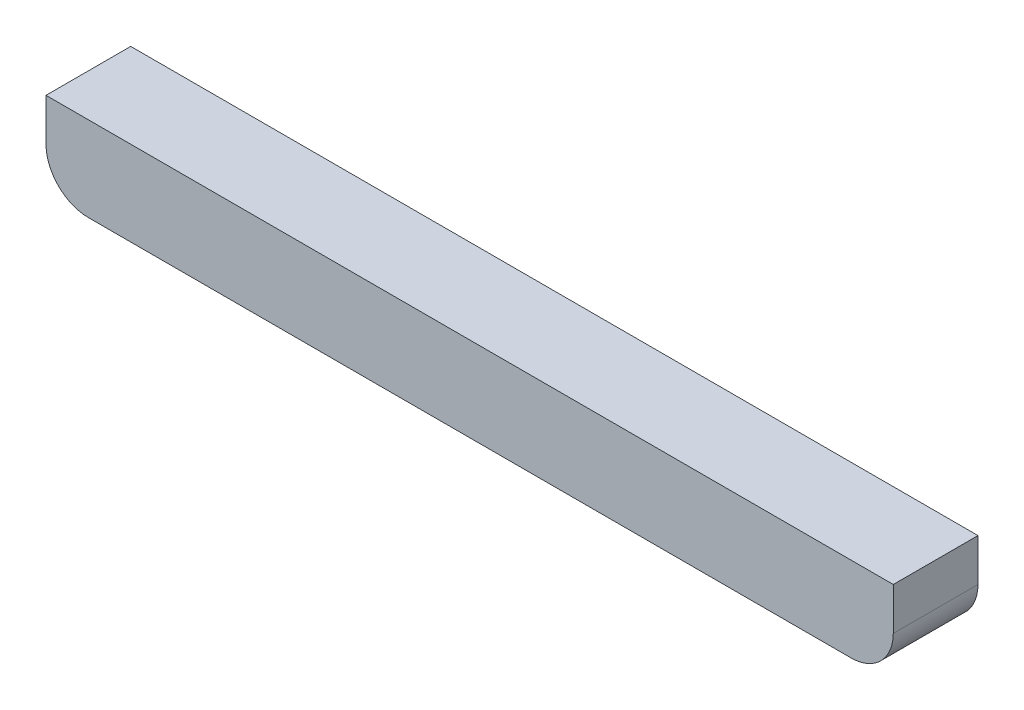
ISO-10303-21;
HEADER;
FILE_DESCRIPTION(('STEP AP214'),'2;1');
FILE_NAME('part.step','',(''),(''),'','','');
FILE_SCHEMA(('AUTOMOTIVE_DESIGN { 1 0 10303 214 1 1 1 1 }'));
ENDSEC;
DATA;
#1=APPLICATION_CONTEXT('core data for automotive mechanical design processes');
#2=APPLICATION_PROTOCOL_DEFINITION('international standard','automotive_design',2000,#1);
#3=PRODUCT_CONTEXT('',#1,'mechanical');
#4=PRODUCT('Part','Part','',(#3));
#5=PRODUCT_RELATED_PRODUCT_CATEGORY('part','',(#4));
#6=PRODUCT_DEFINITION_FORMATION('','',#4);
#7=PRODUCT_DEFINITION_CONTEXT('part definition',#1,'design');
#8=PRODUCT_DEFINITION('design','',#6,#7);
#9=PRODUCT_DEFINITION_SHAPE('','',#8);
#10=(LENGTH_UNIT() NAMED_UNIT(*) SI_UNIT(.MILLI.,.METRE.));
#11=(NAMED_UNIT(*) PLANE_ANGLE_UNIT() SI_UNIT($,.RADIAN.));
#12=(NAMED_UNIT(*) SI_UNIT($,.STERADIAN.) SOLID_ANGLE_UNIT());
#13=UNCERTAINTY_MEASURE_WITH_UNIT(LENGTH_MEASURE(1.E-05),#10,'distance_accuracy_value','');
#14=(GEOMETRIC_REPRESENTATION_CONTEXT(3) GLOBAL_UNCERTAINTY_ASSIGNED_CONTEXT((#13)) GLOBAL_UNIT_ASSIGNED_CONTEXT((#10,
#11,#12)) REPRESENTATION_CONTEXT('',''));
#15=CARTESIAN_POINT('',(0.,0.,0.));
#16=DIRECTION('',(0.,0.,1.));
#17=DIRECTION('',(1.,0.,0.));
#18=AXIS2_PLACEMENT_3D('',#15,#16,#17);
#19=CARTESIAN_POINT('',(0.,0.,5.08));
#20=DIRECTION('',(1.,0.,0.));
#21=DIRECTION('',(0.,0.,-1.));
#22=AXIS2_PLACEMENT_3D('',#19,#20,#21);
#23=PLANE('',#22);
#24=DIRECTION('',(0.,-1.,0.));
#25=VECTOR('',#24,1.);
#26=CARTESIAN_POINT('',(0.,0.,0.));
#27=LINE('',#26,#25);
#28=CARTESIAN_POINT('',(0.,5.08,0.));
#29=VERTEX_POINT('',#28);
#30=CARTESIAN_POINT('',(0.,2.54,0.));
#31=VERTEX_POINT('',#30);
#32=EDGE_CURVE('E112',#29,#31,#27,.T.);
#33=ORIENTED_EDGE('',*,*,#32,.T.);
#34=DIRECTION('',(0.,0.,-1.));
#35=VECTOR('',#34,1.);
#36=CARTESIAN_POINT('',(0.,2.54,5.08));
#37=LINE('',#36,#35);
#38=CARTESIAN_POINT('',(0.,2.54,5.08));
#39=VERTEX_POINT('',#38);
#40=EDGE_CURVE('E56',#31,#39,#37,.F.);
#41=ORIENTED_EDGE('',*,*,#40,.T.);
#42=DIRECTION('',(0.,-1.,0.));
#43=VECTOR('',#42,1.);
#44=CARTESIAN_POINT('',(0.,0.,5.08));
#45=LINE('',#44,#43);
#46=CARTESIAN_POINT('',(0.,5.08,5.08));
#47=VERTEX_POINT('',#46);
#48=EDGE_CURVE('E119',#47,#39,#45,.T.);
#49=ORIENTED_EDGE('',*,*,#48,.F.);
#50=DIRECTION('',(0.,0.,-1.));
#51=VECTOR('',#50,1.);
#52=CARTESIAN_POINT('',(0.,5.08,5.08));
#53=LINE('',#52,#51);
#54=EDGE_CURVE('E104',#47,#29,#53,.T.);
#55=ORIENTED_EDGE('',*,*,#54,.T.);
#56=EDGE_LOOP('',(#33,#41,#49,#55));
#57=FACE_BOUND('',#56,.T.);
#58=ADVANCED_FACE('F33',(#57),#23,.F.);
#59=CARTESIAN_POINT('',(0.,0.,5.08));
#60=DIRECTION('',(0.,1.,0.));
#61=DIRECTION('',(0.,0.,1.));
#62=AXIS2_PLACEMENT_3D('',#59,#60,#61);
#63=PLANE('',#62);
#64=DIRECTION('',(1.,0.,0.));
#65=VECTOR('',#64,1.);
#66=CARTESIAN_POINT('',(0.,0.,5.08));
#67=LINE('',#66,#65);
#68=CARTESIAN_POINT('',(2.54,0.,5.08));
#69=VERTEX_POINT('',#68);
#70=CARTESIAN_POINT('',(48.26,0.,5.08));
#71=VERTEX_POINT('',#70);
#72=EDGE_CURVE('E94',#69,#71,#67,.T.);
#73=ORIENTED_EDGE('',*,*,#72,.F.);
#74=DIRECTION('',(0.,0.,-1.));
#75=VECTOR('',#74,1.);
#76=CARTESIAN_POINT('',(2.54,0.,5.08));
#77=LINE('',#76,#75);
#78=CARTESIAN_POINT('',(2.54,0.,0.));
#79=VERTEX_POINT('',#78);
#80=EDGE_CURVE('E122',#69,#79,#77,.T.);
#81=ORIENTED_EDGE('',*,*,#80,.T.);
#82=DIRECTION('',(1.,0.,0.));
#83=VECTOR('',#82,1.);
#84=CARTESIAN_POINT('',(0.,0.,0.));
#85=LINE('',#84,#83);
#86=CARTESIAN_POINT('',(48.26,0.,0.));
#87=VERTEX_POINT('',#86);
#88=EDGE_CURVE('E114',#79,#87,#85,.T.);
#89=ORIENTED_EDGE('',*,*,#88,.T.);
#90=DIRECTION('',(0.,0.,-1.));
#91=VECTOR('',#90,1.);
#92=CARTESIAN_POINT('',(48.26,0.,5.08));
#93=LINE('',#92,#91);
#94=EDGE_CURVE('E103',#87,#71,#93,.F.);
#95=ORIENTED_EDGE('',*,*,#94,.T.);
#96=EDGE_LOOP('',(#73,#81,#89,#95));
#97=FACE_BOUND('',#96,.T.);
#98=ADVANCED_FACE('F135',(#97),#63,.F.);
#99=CARTESIAN_POINT('',(50.8,0.,5.08));
#100=DIRECTION('',(-1.,0.,0.));
#101=DIRECTION('',(0.,0.,1.));
#102=AXIS2_PLACEMENT_3D('',#99,#100,#101);
#103=PLANE('',#102);
#104=DIRECTION('',(0.,1.,0.));
#105=VECTOR('',#104,1.);
#106=CARTESIAN_POINT('',(50.8,0.,5.08));
#107=LINE('',#106,#105);
#108=CARTESIAN_POINT('',(50.8,2.54,5.08));
#109=VERTEX_POINT('',#108);
#110=CARTESIAN_POINT('',(50.8,5.08,5.08));
#111=VERTEX_POINT('',#110);
#112=EDGE_CURVE('E86',#109,#111,#107,.T.);
#113=ORIENTED_EDGE('',*,*,#112,.F.);
#114=DIRECTION('',(0.,0.,-1.));
#115=VECTOR('',#114,1.);
#116=CARTESIAN_POINT('',(50.8,2.54,5.08));
#117=LINE('',#116,#115);
#118=CARTESIAN_POINT('',(50.8,2.54,0.));
#119=VERTEX_POINT('',#118);
#120=EDGE_CURVE('E11',#109,#119,#117,.T.);
#121=ORIENTED_EDGE('',*,*,#120,.T.);
#122=DIRECTION('',(0.,1.,0.));
#123=VECTOR('',#122,1.);
#124=CARTESIAN_POINT('',(50.8,0.,0.));
#125=LINE('',#124,#123);
#126=CARTESIAN_POINT('',(50.8,5.08,0.));
#127=VERTEX_POINT('',#126);
#128=EDGE_CURVE('E100',#119,#127,#125,.T.);
#129=ORIENTED_EDGE('',*,*,#128,.T.);
#130=DIRECTION('',(0.,0.,-1.));
#131=VECTOR('',#130,1.);
#132=CARTESIAN_POINT('',(50.8,5.08,5.08));
#133=LINE('',#132,#131);
#134=EDGE_CURVE('E97',#111,#127,#133,.T.);
#135=ORIENTED_EDGE('',*,*,#134,.F.);
#136=EDGE_LOOP('',(#113,#121,#129,#135));
#137=FACE_BOUND('',#136,.T.);
#138=ADVANCED_FACE('F98',(#137),#103,.F.);
#139=CARTESIAN_POINT('',(0.,5.08,5.08));
#140=DIRECTION('',(0.,-1.,0.));
#141=DIRECTION('',(0.,0.,-1.));
#142=AXIS2_PLACEMENT_3D('',#139,#140,#141);
#143=PLANE('',#142);
#144=DIRECTION('',(-1.,0.,0.));
#145=VECTOR('',#144,1.);
#146=CARTESIAN_POINT('',(0.,5.08,0.));
#147=LINE('',#146,#145);
#148=EDGE_CURVE('E118',#127,#29,#147,.T.);
#149=ORIENTED_EDGE('',*,*,#148,.T.);
#150=ORIENTED_EDGE('',*,*,#54,.F.);
#151=DIRECTION('',(-1.,0.,0.));
#152=VECTOR('',#151,1.);
#153=CARTESIAN_POINT('',(0.,5.08,5.08));
#154=LINE('',#153,#152);
#155=EDGE_CURVE('E90',#111,#47,#154,.T.);
#156=ORIENTED_EDGE('',*,*,#155,.F.);
#157=ORIENTED_EDGE('',*,*,#134,.T.);
#158=EDGE_LOOP('',(#149,#150,#156,#157));
#159=FACE_BOUND('',#158,.T.);
#160=ADVANCED_FACE('F106',(#159),#143,.F.);
#161=CARTESIAN_POINT('',(0.,0.,5.08));
#162=DIRECTION('',(0.,0.,-1.));
#163=DIRECTION('',(-1.,0.,0.));
#164=AXIS2_PLACEMENT_3D('',#161,#162,#163);
#165=PLANE('',#164);
#166=ORIENTED_EDGE('',*,*,#48,.T.);
#167=CARTESIAN_POINT('',(2.54,2.54,5.08));
#168=DIRECTION('',(0.,0.,-1.));
#169=DIRECTION('',(-1.,0.,0.));
#170=AXIS2_PLACEMENT_3D('',#167,#168,#169);
#171=CIRCLE('',#170,2.54);
#172=EDGE_CURVE('E41',#39,#69,#171,.F.);
#173=ORIENTED_EDGE('',*,*,#172,.T.);
#174=ORIENTED_EDGE('',*,*,#72,.T.);
#175=CARTESIAN_POINT('',(48.26,2.54,5.08));
#176=DIRECTION('',(0.,0.,-1.));
#177=DIRECTION('',(-1.,0.,0.));
#178=AXIS2_PLACEMENT_3D('',#175,#176,#177);
#179=CIRCLE('',#178,2.54);
#180=EDGE_CURVE('E48',#71,#109,#179,.F.);
#181=ORIENTED_EDGE('',*,*,#180,.T.);
#182=ORIENTED_EDGE('',*,*,#112,.T.);
#183=ORIENTED_EDGE('',*,*,#155,.T.);
#184=EDGE_LOOP('',(#166,#173,#174,#181,#182,#183));
#185=FACE_BOUND('',#184,.T.);
#186=ADVANCED_FACE('F88',(#185),#165,.F.);
#187=CARTESIAN_POINT('',(0.,0.,0.));
#188=DIRECTION('',(0.,0.,-1.));
#189=DIRECTION('',(-1.,0.,0.));
#190=AXIS2_PLACEMENT_3D('',#187,#188,#189);
#191=PLANE('',#190);
#192=ORIENTED_EDGE('',*,*,#88,.F.);
#193=CARTESIAN_POINT('',(2.54,2.54,0.));
#194=DIRECTION('',(0.,0.,-1.));
#195=DIRECTION('',(-1.,0.,0.));
#196=AXIS2_PLACEMENT_3D('',#193,#194,#195);
#197=CIRCLE('',#196,2.54);
#198=EDGE_CURVE('E127',#79,#31,#197,.T.);
#199=ORIENTED_EDGE('',*,*,#198,.T.);
#200=ORIENTED_EDGE('',*,*,#32,.F.);
#201=ORIENTED_EDGE('',*,*,#148,.F.);
#202=ORIENTED_EDGE('',*,*,#128,.F.);
#203=CARTESIAN_POINT('',(48.26,2.54,0.));
#204=DIRECTION('',(0.,0.,-1.));
#205=DIRECTION('',(-1.,0.,0.));
#206=AXIS2_PLACEMENT_3D('',#203,#204,#205);
#207=CIRCLE('',#206,2.54);
#208=EDGE_CURVE('E125',#119,#87,#207,.T.);
#209=ORIENTED_EDGE('',*,*,#208,.T.);
#210=EDGE_LOOP('',(#192,#199,#200,#201,#202,#209));
#211=FACE_BOUND('',#210,.T.);
#212=ADVANCED_FACE('F141',(#211),#191,.T.);
#213=CARTESIAN_POINT('',(2.54,2.54,5.08));
#214=DIRECTION('',(0.,0.,-1.));
#215=DIRECTION('',(-1.,0.,0.));
#216=AXIS2_PLACEMENT_3D('',#213,#214,#215);
#217=CYLINDRICAL_SURFACE('',#216,2.54);
#218=ORIENTED_EDGE('',*,*,#172,.F.);
#219=ORIENTED_EDGE('',*,*,#40,.F.);
#220=ORIENTED_EDGE('',*,*,#198,.F.);
#221=ORIENTED_EDGE('',*,*,#80,.F.);
#222=EDGE_LOOP('',(#218,#219,#220,#221));
#223=FACE_BOUND('',#222,.T.);
#224=ADVANCED_FACE('F138',(#223),#217,.T.);
#225=CARTESIAN_POINT('',(48.26,2.54,5.08));
#226=DIRECTION('',(0.,0.,-1.));
#227=DIRECTION('',(-1.,0.,0.));
#228=AXIS2_PLACEMENT_3D('',#225,#226,#227);
#229=CYLINDRICAL_SURFACE('',#228,2.54);
#230=ORIENTED_EDGE('',*,*,#180,.F.);
#231=ORIENTED_EDGE('',*,*,#94,.F.);
#232=ORIENTED_EDGE('',*,*,#208,.F.);
#233=ORIENTED_EDGE('',*,*,#120,.F.);
#234=EDGE_LOOP('',(#230,#231,#232,#233));
#235=FACE_BOUND('',#234,.T.);
#236=ADVANCED_FACE('F35',(#235),#229,.T.);
#237=CLOSED_SHELL('',(#58,#98,#138,#160,#186,#212,#224,#236));
#238=MANIFOLD_SOLID_BREP('B2',#237);
#239=ADVANCED_BREP_SHAPE_REPRESENTATION('',(#18,#238),#14);
#240=SHAPE_DEFINITION_REPRESENTATION(#9,#239);
ENDSEC;
END-ISO-10303-21;
